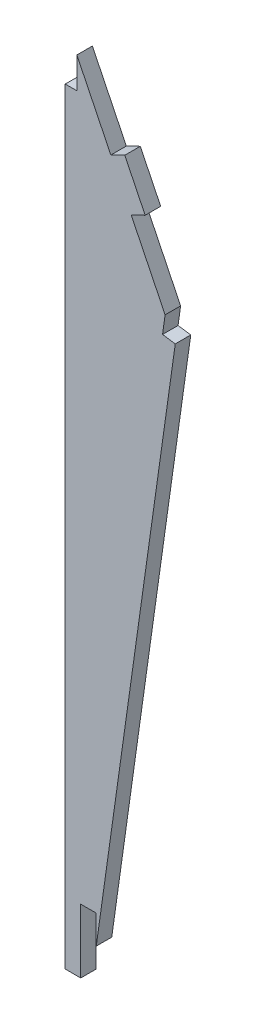
ISO-10303-21;
HEADER;
FILE_DESCRIPTION(('STEP AP214'),'2;1');
FILE_NAME('part.step','',(''),(''),'','','');
FILE_SCHEMA(('AUTOMOTIVE_DESIGN { 1 0 10303 214 1 1 1 1 }'));
ENDSEC;
DATA;
#1=APPLICATION_CONTEXT('core data for automotive mechanical design processes');
#2=APPLICATION_PROTOCOL_DEFINITION('international standard','automotive_design',2000,#1);
#3=PRODUCT_CONTEXT('',#1,'mechanical');
#4=PRODUCT('Part','Part','',(#3));
#5=PRODUCT_RELATED_PRODUCT_CATEGORY('part','',(#4));
#6=PRODUCT_DEFINITION_FORMATION('','',#4);
#7=PRODUCT_DEFINITION_CONTEXT('part definition',#1,'design');
#8=PRODUCT_DEFINITION('design','',#6,#7);
#9=PRODUCT_DEFINITION_SHAPE('','',#8);
#10=(LENGTH_UNIT() NAMED_UNIT(*) SI_UNIT(.MILLI.,.METRE.));
#11=(NAMED_UNIT(*) PLANE_ANGLE_UNIT() SI_UNIT($,.RADIAN.));
#12=(NAMED_UNIT(*) SI_UNIT($,.STERADIAN.) SOLID_ANGLE_UNIT());
#13=UNCERTAINTY_MEASURE_WITH_UNIT(LENGTH_MEASURE(1.E-05),#10,'distance_accuracy_value','');
#14=(GEOMETRIC_REPRESENTATION_CONTEXT(3) GLOBAL_UNCERTAINTY_ASSIGNED_CONTEXT((#13)) GLOBAL_UNIT_ASSIGNED_CONTEXT((#10,
#11,#12)) REPRESENTATION_CONTEXT('',''));
#15=CARTESIAN_POINT('',(0.,0.,0.));
#16=DIRECTION('',(0.,0.,1.));
#17=DIRECTION('',(1.,0.,0.));
#18=AXIS2_PLACEMENT_3D('',#15,#16,#17);
#19=CARTESIAN_POINT('',(11.1121257804898,105.70155755787,2.));
#20=DIRECTION('',(-0.898794046299168,-0.438371146789076,0.));
#21=DIRECTION('',(0.438371146789076,-0.898794046299168,0.));
#22=AXIS2_PLACEMENT_3D('',#19,#20,#21);
#23=PLANE('',#22);
#24=DIRECTION('',(-0.438371146789076,0.898794046299168,0.));
#25=VECTOR('',#24,1.);
#26=CARTESIAN_POINT('',(11.1121257804898,105.70155755787,0.));
#27=LINE('',#26,#25);
#28=CARTESIAN_POINT('',(15.4958372483807,96.7136170948779,0.));
#29=VERTEX_POINT('',#28);
#30=CARTESIAN_POINT('',(11.1121257804898,105.70155755787,0.));
#31=VERTEX_POINT('',#30);
#32=EDGE_CURVE('E174',#29,#31,#27,.T.);
#33=ORIENTED_EDGE('',*,*,#32,.T.);
#34=DIRECTION('',(0.,0.,-1.));
#35=VECTOR('',#34,1.);
#36=CARTESIAN_POINT('',(11.1121257804898,105.70155755787,2.));
#37=LINE('',#36,#35);
#38=CARTESIAN_POINT('',(11.1121257804898,105.70155755787,2.));
#39=VERTEX_POINT('',#38);
#40=EDGE_CURVE('E11',#39,#31,#37,.T.);
#41=ORIENTED_EDGE('',*,*,#40,.F.);
#42=DIRECTION('',(-0.438371146789076,0.898794046299168,0.));
#43=VECTOR('',#42,1.);
#44=CARTESIAN_POINT('',(11.1121257804898,105.70155755787,2.));
#45=LINE('',#44,#43);
#46=CARTESIAN_POINT('',(15.4958372483807,96.7136170948779,2.));
#47=VERTEX_POINT('',#46);
#48=EDGE_CURVE('E202',#47,#39,#45,.T.);
#49=ORIENTED_EDGE('',*,*,#48,.F.);
#50=DIRECTION('',(0.,0.,-1.));
#51=VECTOR('',#50,1.);
#52=CARTESIAN_POINT('',(15.4958372483807,96.7136170948779,2.));
#53=LINE('',#52,#51);
#54=EDGE_CURVE('E170',#47,#29,#53,.T.);
#55=ORIENTED_EDGE('',*,*,#54,.T.);
#56=EDGE_LOOP('',(#33,#41,#49,#55));
#57=FACE_BOUND('',#56,.T.);
#58=ADVANCED_FACE('F36',(#57),#23,.F.);
#59=CARTESIAN_POINT('',(11.1121257804898,105.70155755787,2.));
#60=DIRECTION('',(1.,0.,0.));
#61=DIRECTION('',(0.,0.,-1.));
#62=AXIS2_PLACEMENT_3D('',#59,#60,#61);
#63=PLANE('',#62);
#64=DIRECTION('',(0.,-1.,0.));
#65=VECTOR('',#64,1.);
#66=CARTESIAN_POINT('',(11.1121257804898,105.70155755787,0.));
#67=LINE('',#66,#65);
#68=CARTESIAN_POINT('',(11.1121257804898,101.70155755787,0.));
#69=VERTEX_POINT('',#68);
#70=EDGE_CURVE('E177',#31,#69,#67,.T.);
#71=ORIENTED_EDGE('',*,*,#70,.T.);
#72=DIRECTION('',(0.,0.,-1.));
#73=VECTOR('',#72,1.);
#74=CARTESIAN_POINT('',(11.1121257804898,101.70155755787,2.));
#75=LINE('',#74,#73);
#76=CARTESIAN_POINT('',(11.1121257804898,101.70155755787,2.));
#77=VERTEX_POINT('',#76);
#78=EDGE_CURVE('E44',#77,#69,#75,.T.);
#79=ORIENTED_EDGE('',*,*,#78,.F.);
#80=DIRECTION('',(0.,-1.,0.));
#81=VECTOR('',#80,1.);
#82=CARTESIAN_POINT('',(11.1121257804898,105.70155755787,2.));
#83=LINE('',#82,#81);
#84=EDGE_CURVE('E116',#39,#77,#83,.T.);
#85=ORIENTED_EDGE('',*,*,#84,.F.);
#86=ORIENTED_EDGE('',*,*,#40,.T.);
#87=EDGE_LOOP('',(#71,#79,#85,#86));
#88=FACE_BOUND('',#87,.T.);
#89=ADVANCED_FACE('F295',(#88),#63,.F.);
#90=CARTESIAN_POINT('',(11.1121257804898,101.70155755787,2.));
#91=DIRECTION('',(0.,-1.,0.));
#92=DIRECTION('',(0.,0.,-1.));
#93=AXIS2_PLACEMENT_3D('',#90,#91,#92);
#94=PLANE('',#93);
#95=DIRECTION('',(-1.,0.,0.));
#96=VECTOR('',#95,1.);
#97=CARTESIAN_POINT('',(11.1121257804898,101.70155755787,0.));
#98=LINE('',#97,#96);
#99=CARTESIAN_POINT('',(9.61212578048981,101.70155755787,0.));
#100=VERTEX_POINT('',#99);
#101=EDGE_CURVE('E179',#69,#100,#98,.T.);
#102=ORIENTED_EDGE('',*,*,#101,.T.);
#103=DIRECTION('',(0.,0.,-1.));
#104=VECTOR('',#103,1.);
#105=CARTESIAN_POINT('',(9.61212578048981,101.70155755787,2.));
#106=LINE('',#105,#104);
#107=CARTESIAN_POINT('',(9.61212578048981,101.70155755787,2.));
#108=VERTEX_POINT('',#107);
#109=EDGE_CURVE('E230',#108,#100,#106,.T.);
#110=ORIENTED_EDGE('',*,*,#109,.F.);
#111=DIRECTION('',(-1.,0.,0.));
#112=VECTOR('',#111,1.);
#113=CARTESIAN_POINT('',(11.1121257804898,101.70155755787,2.));
#114=LINE('',#113,#112);
#115=EDGE_CURVE('E238',#77,#108,#114,.T.);
#116=ORIENTED_EDGE('',*,*,#115,.F.);
#117=ORIENTED_EDGE('',*,*,#78,.T.);
#118=EDGE_LOOP('',(#102,#110,#116,#117));
#119=FACE_BOUND('',#118,.T.);
#120=ADVANCED_FACE('F236',(#119),#94,.F.);
#121=CARTESIAN_POINT('',(9.61212578048981,101.70155755787,2.));
#122=DIRECTION('',(1.,0.,0.));
#123=DIRECTION('',(0.,0.,-1.));
#124=AXIS2_PLACEMENT_3D('',#121,#122,#123);
#125=PLANE('',#124);
#126=DIRECTION('',(0.,-1.,0.));
#127=VECTOR('',#126,1.);
#128=CARTESIAN_POINT('',(9.61212578048981,101.70155755787,0.));
#129=LINE('',#128,#127);
#130=CARTESIAN_POINT('',(9.61212578048981,2.83160343748159,0.));
#131=VERTEX_POINT('',#130);
#132=EDGE_CURVE('E181',#100,#131,#129,.T.);
#133=ORIENTED_EDGE('',*,*,#132,.T.);
#134=DIRECTION('',(0.,0.,-1.));
#135=VECTOR('',#134,1.);
#136=CARTESIAN_POINT('',(9.61212578048981,2.83160343748159,2.));
#137=LINE('',#136,#135);
#138=CARTESIAN_POINT('',(9.61212578048981,2.83160343748159,2.));
#139=VERTEX_POINT('',#138);
#140=EDGE_CURVE('E227',#139,#131,#137,.T.);
#141=ORIENTED_EDGE('',*,*,#140,.F.);
#142=DIRECTION('',(0.,-1.,0.));
#143=VECTOR('',#142,1.);
#144=CARTESIAN_POINT('',(9.61212578048981,101.70155755787,2.));
#145=LINE('',#144,#143);
#146=EDGE_CURVE('E256',#108,#139,#145,.T.);
#147=ORIENTED_EDGE('',*,*,#146,.F.);
#148=ORIENTED_EDGE('',*,*,#109,.T.);
#149=EDGE_LOOP('',(#133,#141,#147,#148));
#150=FACE_BOUND('',#149,.T.);
#151=ADVANCED_FACE('F247',(#150),#125,.F.);
#152=CARTESIAN_POINT('',(9.61212578048981,2.83160343748159,2.));
#153=DIRECTION('',(0.,1.,0.));
#154=DIRECTION('',(0.,0.,1.));
#155=AXIS2_PLACEMENT_3D('',#152,#153,#154);
#156=PLANE('',#155);
#157=DIRECTION('',(1.,0.,0.));
#158=VECTOR('',#157,1.);
#159=CARTESIAN_POINT('',(9.61212578048981,2.83160343748159,0.));
#160=LINE('',#159,#158);
#161=CARTESIAN_POINT('',(11.6121257804907,2.83160343748159,0.));
#162=VERTEX_POINT('',#161);
#163=EDGE_CURVE('E183',#131,#162,#160,.T.);
#164=ORIENTED_EDGE('',*,*,#163,.T.);
#165=DIRECTION('',(0.,0.,-1.));
#166=VECTOR('',#165,1.);
#167=CARTESIAN_POINT('',(11.6121257804907,2.83160343748159,2.));
#168=LINE('',#167,#166);
#169=CARTESIAN_POINT('',(11.6121257804907,2.83160343748159,2.));
#170=VERTEX_POINT('',#169);
#171=EDGE_CURVE('E224',#170,#162,#168,.T.);
#172=ORIENTED_EDGE('',*,*,#171,.F.);
#173=DIRECTION('',(1.,0.,0.));
#174=VECTOR('',#173,1.);
#175=CARTESIAN_POINT('',(9.61212578048981,2.83160343748159,2.));
#176=LINE('',#175,#174);
#177=EDGE_CURVE('E253',#139,#170,#176,.T.);
#178=ORIENTED_EDGE('',*,*,#177,.F.);
#179=ORIENTED_EDGE('',*,*,#140,.T.);
#180=EDGE_LOOP('',(#164,#172,#178,#179));
#181=FACE_BOUND('',#180,.T.);
#182=ADVANCED_FACE('F251',(#181),#156,.F.);
#183=CARTESIAN_POINT('',(11.6121257804907,2.83160343748159,2.));
#184=DIRECTION('',(-1.,0.,0.));
#185=DIRECTION('',(0.,0.,1.));
#186=AXIS2_PLACEMENT_3D('',#183,#184,#185);
#187=PLANE('',#186);
#188=DIRECTION('',(0.,1.,0.));
#189=VECTOR('',#188,1.);
#190=CARTESIAN_POINT('',(11.6121257804907,2.83160343748159,0.));
#191=LINE('',#190,#189);
#192=CARTESIAN_POINT('',(11.6121257804907,11.0816034374925,0.));
#193=VERTEX_POINT('',#192);
#194=EDGE_CURVE('E185',#162,#193,#191,.T.);
#195=ORIENTED_EDGE('',*,*,#194,.T.);
#196=DIRECTION('',(0.,0.,-1.));
#197=VECTOR('',#196,1.);
#198=CARTESIAN_POINT('',(11.6121257804907,11.0816034374925,2.));
#199=LINE('',#198,#197);
#200=CARTESIAN_POINT('',(11.6121257804907,11.0816034374925,2.));
#201=VERTEX_POINT('',#200);
#202=EDGE_CURVE('E221',#201,#193,#199,.T.);
#203=ORIENTED_EDGE('',*,*,#202,.F.);
#204=DIRECTION('',(0.,1.,0.));
#205=VECTOR('',#204,1.);
#206=CARTESIAN_POINT('',(11.6121257804907,2.83160343748159,2.));
#207=LINE('',#206,#205);
#208=EDGE_CURVE('E255',#170,#201,#207,.T.);
#209=ORIENTED_EDGE('',*,*,#208,.F.);
#210=ORIENTED_EDGE('',*,*,#171,.T.);
#211=EDGE_LOOP('',(#195,#203,#209,#210));
#212=FACE_BOUND('',#211,.T.);
#213=ADVANCED_FACE('F308',(#212),#187,.F.);
#214=CARTESIAN_POINT('',(11.6121257804907,11.0816034374925,2.));
#215=DIRECTION('',(0.,1.,0.));
#216=DIRECTION('',(0.,0.,1.));
#217=AXIS2_PLACEMENT_3D('',#214,#215,#216);
#218=PLANE('',#217);
#219=DIRECTION('',(1.,0.,0.));
#220=VECTOR('',#219,1.);
#221=CARTESIAN_POINT('',(11.6121257804907,11.0816034374925,0.));
#222=LINE('',#221,#220);
#223=CARTESIAN_POINT('',(13.6121257804907,11.0816034374925,0.));
#224=VERTEX_POINT('',#223);
#225=EDGE_CURVE('E187',#193,#224,#222,.T.);
#226=ORIENTED_EDGE('',*,*,#225,.T.);
#227=DIRECTION('',(0.,0.,-1.));
#228=VECTOR('',#227,1.);
#229=CARTESIAN_POINT('',(13.6121257804907,11.0816034374925,2.));
#230=LINE('',#229,#228);
#231=CARTESIAN_POINT('',(13.6121257804907,11.0816034374925,2.));
#232=VERTEX_POINT('',#231);
#233=EDGE_CURVE('E218',#232,#224,#230,.T.);
#234=ORIENTED_EDGE('',*,*,#233,.F.);
#235=DIRECTION('',(1.,0.,0.));
#236=VECTOR('',#235,1.);
#237=CARTESIAN_POINT('',(11.6121257804907,11.0816034374925,2.));
#238=LINE('',#237,#236);
#239=EDGE_CURVE('E258',#201,#232,#238,.T.);
#240=ORIENTED_EDGE('',*,*,#239,.F.);
#241=ORIENTED_EDGE('',*,*,#202,.T.);
#242=EDGE_LOOP('',(#226,#234,#240,#241));
#243=FACE_BOUND('',#242,.T.);
#244=ADVANCED_FACE('F311',(#243),#218,.F.);
#245=CARTESIAN_POINT('',(13.6121257804907,11.0816034374925,2.));
#246=DIRECTION('',(1.,0.,0.));
#247=DIRECTION('',(0.,0.,-1.));
#248=AXIS2_PLACEMENT_3D('',#245,#246,#247);
#249=PLANE('',#248);
#250=DIRECTION('',(0.,-1.,0.));
#251=VECTOR('',#250,1.);
#252=CARTESIAN_POINT('',(13.6121257804907,11.0816034374925,0.));
#253=LINE('',#252,#251);
#254=CARTESIAN_POINT('',(13.6121257804907,7.39072847064062,0.));
#255=VERTEX_POINT('',#254);
#256=EDGE_CURVE('E189',#224,#255,#253,.T.);
#257=ORIENTED_EDGE('',*,*,#256,.T.);
#258=DIRECTION('',(0.,0.,-1.));
#259=VECTOR('',#258,1.);
#260=CARTESIAN_POINT('',(13.6121257804907,7.39072847064062,2.));
#261=LINE('',#260,#259);
#262=CARTESIAN_POINT('',(13.6121257804907,7.39072847064062,2.));
#263=VERTEX_POINT('',#262);
#264=EDGE_CURVE('E215',#263,#255,#261,.T.);
#265=ORIENTED_EDGE('',*,*,#264,.F.);
#266=DIRECTION('',(0.,-1.,0.));
#267=VECTOR('',#266,1.);
#268=CARTESIAN_POINT('',(13.6121257804907,11.0816034374925,2.));
#269=LINE('',#268,#267);
#270=EDGE_CURVE('E264',#232,#263,#269,.T.);
#271=ORIENTED_EDGE('',*,*,#270,.F.);
#272=ORIENTED_EDGE('',*,*,#233,.T.);
#273=EDGE_LOOP('',(#257,#265,#271,#272));
#274=FACE_BOUND('',#273,.T.);
#275=ADVANCED_FACE('F315',(#274),#249,.F.);
#276=CARTESIAN_POINT('',(13.6121257804907,7.39072847064062,2.));
#277=DIRECTION('',(-0.990227596822008,0.139460770441409,0.));
#278=DIRECTION('',(-0.139460770441409,-0.990227596822008,0.));
#279=AXIS2_PLACEMENT_3D('',#276,#277,#278);
#280=PLANE('',#279);
#281=DIRECTION('',(0.139460770441409,0.990227596822008,0.));
#282=VECTOR('',#281,1.);
#283=CARTESIAN_POINT('',(13.6121257804907,7.39072847064062,0.));
#284=LINE('',#283,#282);
#285=CARTESIAN_POINT('',(23.8059659715545,79.7710963894137,0.));
#286=VERTEX_POINT('',#285);
#287=EDGE_CURVE('E191',#255,#286,#284,.T.);
#288=ORIENTED_EDGE('',*,*,#287,.T.);
#289=DIRECTION('',(0.,0.,-1.));
#290=VECTOR('',#289,1.);
#291=CARTESIAN_POINT('',(23.8059659715545,79.7710963894137,2.));
#292=LINE('',#291,#290);
#293=CARTESIAN_POINT('',(23.8059659715545,79.7710963894137,2.));
#294=VERTEX_POINT('',#293);
#295=EDGE_CURVE('E212',#294,#286,#292,.T.);
#296=ORIENTED_EDGE('',*,*,#295,.F.);
#297=DIRECTION('',(0.139460770441409,0.990227596822008,0.));
#298=VECTOR('',#297,1.);
#299=CARTESIAN_POINT('',(13.6121257804907,7.39072847064062,2.));
#300=LINE('',#299,#298);
#301=EDGE_CURVE('E266',#263,#294,#300,.T.);
#302=ORIENTED_EDGE('',*,*,#301,.F.);
#303=ORIENTED_EDGE('',*,*,#264,.T.);
#304=EDGE_LOOP('',(#288,#296,#302,#303));
#305=FACE_BOUND('',#304,.T.);
#306=ADVANCED_FACE('F319',(#305),#280,.F.);
#307=CARTESIAN_POINT('',(23.8059659715545,79.7710963894137,2.));
#308=DIRECTION('',(-0.139460770441563,-0.990227596821986,0.));
#309=DIRECTION('',(0.990227596821986,-0.139460770441563,0.));
#310=AXIS2_PLACEMENT_3D('',#307,#308,#309);
#311=PLANE('',#310);
#312=DIRECTION('',(-0.990227596821986,0.139460770441563,0.));
#313=VECTOR('',#312,1.);
#314=CARTESIAN_POINT('',(23.8059659715545,79.7710963894137,0.));
#315=LINE('',#314,#313);
#316=CARTESIAN_POINT('',(22.1644159934294,80.0022875068926,0.));
#317=VERTEX_POINT('',#316);
#318=EDGE_CURVE('E193',#286,#317,#315,.T.);
#319=ORIENTED_EDGE('',*,*,#318,.T.);
#320=DIRECTION('',(0.,0.,-1.));
#321=VECTOR('',#320,1.);
#322=CARTESIAN_POINT('',(22.1644159934294,80.0022875068926,2.));
#323=LINE('',#322,#321);
#324=CARTESIAN_POINT('',(22.1644159934294,80.0022875068926,2.));
#325=VERTEX_POINT('',#324);
#326=EDGE_CURVE('E209',#325,#317,#323,.T.);
#327=ORIENTED_EDGE('',*,*,#326,.F.);
#328=DIRECTION('',(-0.990227596821986,0.139460770441563,0.));
#329=VECTOR('',#328,1.);
#330=CARTESIAN_POINT('',(23.8059659715545,79.7710963894137,2.));
#331=LINE('',#330,#329);
#332=EDGE_CURVE('E268',#294,#325,#331,.T.);
#333=ORIENTED_EDGE('',*,*,#332,.F.);
#334=ORIENTED_EDGE('',*,*,#295,.T.);
#335=EDGE_LOOP('',(#319,#327,#333,#334));
#336=FACE_BOUND('',#335,.T.);
#337=ADVANCED_FACE('F323',(#336),#311,.F.);
#338=CARTESIAN_POINT('',(22.1644159934294,80.0022875068926,2.));
#339=DIRECTION('',(-0.990227596822041,0.139460770441173,0.));
#340=DIRECTION('',(-0.139460770441173,-0.990227596822041,0.));
#341=AXIS2_PLACEMENT_3D('',#338,#339,#340);
#342=PLANE('',#341);
#343=DIRECTION('',(0.139460770441173,0.990227596822041,0.));
#344=VECTOR('',#343,1.);
#345=CARTESIAN_POINT('',(22.1644159934294,80.0022875068926,0.));
#346=LINE('',#345,#344);
#347=CARTESIAN_POINT('',(22.4964905755041,82.3601506847117,0.));
#348=VERTEX_POINT('',#347);
#349=EDGE_CURVE('E195',#317,#348,#346,.T.);
#350=ORIENTED_EDGE('',*,*,#349,.T.);
#351=DIRECTION('',(0.,0.,-1.));
#352=VECTOR('',#351,1.);
#353=CARTESIAN_POINT('',(22.4964905755041,82.3601506847117,2.));
#354=LINE('',#353,#352);
#355=CARTESIAN_POINT('',(22.4964905755041,82.3601506847117,2.));
#356=VERTEX_POINT('',#355);
#357=EDGE_CURVE('E206',#356,#348,#354,.T.);
#358=ORIENTED_EDGE('',*,*,#357,.F.);
#359=DIRECTION('',(0.139460770441173,0.990227596822041,0.));
#360=VECTOR('',#359,1.);
#361=CARTESIAN_POINT('',(22.1644159934294,80.0022875068926,2.));
#362=LINE('',#361,#360);
#363=EDGE_CURVE('E270',#325,#356,#362,.T.);
#364=ORIENTED_EDGE('',*,*,#363,.F.);
#365=ORIENTED_EDGE('',*,*,#326,.T.);
#366=EDGE_LOOP('',(#350,#358,#364,#365));
#367=FACE_BOUND('',#366,.T.);
#368=ADVANCED_FACE('F276',(#367),#342,.F.);
#369=CARTESIAN_POINT('',(18.1260641291155,91.3208528170826,2.));
#370=DIRECTION('',(-0.898794046299179,-0.438371146789053,0.));
#371=DIRECTION('',(0.438371146789053,-0.898794046299179,0.));
#372=AXIS2_PLACEMENT_3D('',#369,#370,#371);
#373=PLANE('',#372);
#374=DIRECTION('',(-0.438371146789053,0.898794046299179,0.));
#375=VECTOR('',#374,1.);
#376=CARTESIAN_POINT('',(18.1260641291155,91.3208528170826,0.));
#377=LINE('',#376,#375);
#378=CARTESIAN_POINT('',(18.1260641291155,91.3208528170826,0.));
#379=VERTEX_POINT('',#378);
#380=EDGE_CURVE('E197',#348,#379,#377,.T.);
#381=ORIENTED_EDGE('',*,*,#380,.T.);
#382=DIRECTION('',(0.,0.,-1.));
#383=VECTOR('',#382,1.);
#384=CARTESIAN_POINT('',(18.1260641291155,91.3208528170826,2.));
#385=LINE('',#384,#383);
#386=CARTESIAN_POINT('',(18.1260641291155,91.3208528170826,2.));
#387=VERTEX_POINT('',#386);
#388=EDGE_CURVE('E165',#387,#379,#385,.T.);
#389=ORIENTED_EDGE('',*,*,#388,.F.);
#390=DIRECTION('',(-0.438371146789053,0.898794046299179,0.));
#391=VECTOR('',#390,1.);
#392=CARTESIAN_POINT('',(18.1260641291155,91.3208528170826,2.));
#393=LINE('',#392,#391);
#394=EDGE_CURVE('E156',#356,#387,#393,.T.);
#395=ORIENTED_EDGE('',*,*,#394,.F.);
#396=ORIENTED_EDGE('',*,*,#357,.T.);
#397=EDGE_LOOP('',(#381,#389,#395,#396));
#398=FACE_BOUND('',#397,.T.);
#399=ADVANCED_FACE('F280',(#398),#373,.F.);
#400=CARTESIAN_POINT('',(19.9236522217143,92.1975951106606,2.));
#401=DIRECTION('',(-0.438371146788926,0.898794046299241,0.));
#402=DIRECTION('',(-0.898794046299241,-0.438371146788927,0.));
#403=AXIS2_PLACEMENT_3D('',#400,#401,#402);
#404=PLANE('',#403);
#405=DIRECTION('',(0.898794046299241,0.438371146788926,0.));
#406=VECTOR('',#405,1.);
#407=CARTESIAN_POINT('',(19.9236522217143,92.1975951106606,0.));
#408=LINE('',#407,#406);
#409=CARTESIAN_POINT('',(19.9236522217143,92.1975951106606,0.));
#410=VERTEX_POINT('',#409);
#411=EDGE_CURVE('E164',#379,#410,#408,.T.);
#412=ORIENTED_EDGE('',*,*,#411,.T.);
#413=DIRECTION('',(0.,0.,-1.));
#414=VECTOR('',#413,1.);
#415=CARTESIAN_POINT('',(19.9236522217143,92.1975951106606,2.));
#416=LINE('',#415,#414);
#417=CARTESIAN_POINT('',(19.9236522217143,92.1975951106606,2.));
#418=VERTEX_POINT('',#417);
#419=EDGE_CURVE('E161',#418,#410,#416,.T.);
#420=ORIENTED_EDGE('',*,*,#419,.F.);
#421=DIRECTION('',(0.898794046299241,0.438371146788926,0.));
#422=VECTOR('',#421,1.);
#423=CARTESIAN_POINT('',(19.9236522217143,92.1975951106606,2.));
#424=LINE('',#423,#422);
#425=EDGE_CURVE('E150',#387,#418,#424,.T.);
#426=ORIENTED_EDGE('',*,*,#425,.F.);
#427=ORIENTED_EDGE('',*,*,#388,.T.);
#428=EDGE_LOOP('',(#412,#420,#426,#427));
#429=FACE_BOUND('',#428,.T.);
#430=ADVANCED_FACE('F162',(#429),#404,.F.);
#431=CARTESIAN_POINT('',(17.2934253409767,97.590359388455,2.));
#432=DIRECTION('',(-0.898794046298942,-0.438371146789539,0.));
#433=DIRECTION('',(0.438371146789539,-0.898794046298942,0.));
#434=AXIS2_PLACEMENT_3D('',#431,#432,#433);
#435=PLANE('',#434);
#436=DIRECTION('',(-0.438371146789539,0.898794046298942,0.));
#437=VECTOR('',#436,1.);
#438=CARTESIAN_POINT('',(17.2934253409767,97.590359388455,0.));
#439=LINE('',#438,#437);
#440=CARTESIAN_POINT('',(17.2934253409767,97.590359388455,0.));
#441=VERTEX_POINT('',#440);
#442=EDGE_CURVE('E102',#410,#441,#439,.T.);
#443=ORIENTED_EDGE('',*,*,#442,.T.);
#444=DIRECTION('',(0.,0.,-1.));
#445=VECTOR('',#444,1.);
#446=CARTESIAN_POINT('',(17.2934253409767,97.590359388455,2.));
#447=LINE('',#446,#445);
#448=CARTESIAN_POINT('',(17.2934253409767,97.590359388455,2.));
#449=VERTEX_POINT('',#448);
#450=EDGE_CURVE('E166',#449,#441,#447,.T.);
#451=ORIENTED_EDGE('',*,*,#450,.F.);
#452=DIRECTION('',(-0.438371146789539,0.898794046298942,0.));
#453=VECTOR('',#452,1.);
#454=CARTESIAN_POINT('',(17.2934253409767,97.590359388455,2.));
#455=LINE('',#454,#453);
#456=EDGE_CURVE('E154',#418,#449,#455,.T.);
#457=ORIENTED_EDGE('',*,*,#456,.F.);
#458=ORIENTED_EDGE('',*,*,#419,.T.);
#459=EDGE_LOOP('',(#443,#451,#457,#458));
#460=FACE_BOUND('',#459,.T.);
#461=ADVANCED_FACE('F168',(#460),#435,.F.);
#462=CARTESIAN_POINT('',(15.4958372483807,96.7136170948779,2.));
#463=DIRECTION('',(0.4383711467891,-0.898794046299156,0.));
#464=DIRECTION('',(0.898794046299156,0.4383711467891,0.));
#465=AXIS2_PLACEMENT_3D('',#462,#463,#464);
#466=PLANE('',#465);
#467=DIRECTION('',(-0.898794046299156,-0.4383711467891,0.));
#468=VECTOR('',#467,1.);
#469=CARTESIAN_POINT('',(15.4958372483807,96.7136170948779,0.));
#470=LINE('',#469,#468);
#471=EDGE_CURVE('E108',#441,#29,#470,.T.);
#472=ORIENTED_EDGE('',*,*,#471,.T.);
#473=ORIENTED_EDGE('',*,*,#54,.F.);
#474=DIRECTION('',(-0.898794046299156,-0.4383711467891,0.));
#475=VECTOR('',#474,1.);
#476=CARTESIAN_POINT('',(15.4958372483807,96.7136170948779,2.));
#477=LINE('',#476,#475);
#478=EDGE_CURVE('E52',#449,#47,#477,.T.);
#479=ORIENTED_EDGE('',*,*,#478,.F.);
#480=ORIENTED_EDGE('',*,*,#450,.T.);
#481=EDGE_LOOP('',(#472,#473,#479,#480));
#482=FACE_BOUND('',#481,.T.);
#483=ADVANCED_FACE('F284',(#482),#466,.F.);
#484=CARTESIAN_POINT('',(0.,0.,2.));
#485=DIRECTION('',(0.,0.,1.));
#486=DIRECTION('',(1.,0.,0.));
#487=AXIS2_PLACEMENT_3D('',#484,#485,#486);
#488=PLANE('',#487);
#489=ORIENTED_EDGE('',*,*,#48,.T.);
#490=ORIENTED_EDGE('',*,*,#84,.T.);
#491=ORIENTED_EDGE('',*,*,#115,.T.);
#492=ORIENTED_EDGE('',*,*,#146,.T.);
#493=ORIENTED_EDGE('',*,*,#177,.T.);
#494=ORIENTED_EDGE('',*,*,#208,.T.);
#495=ORIENTED_EDGE('',*,*,#239,.T.);
#496=ORIENTED_EDGE('',*,*,#270,.T.);
#497=ORIENTED_EDGE('',*,*,#301,.T.);
#498=ORIENTED_EDGE('',*,*,#332,.T.);
#499=ORIENTED_EDGE('',*,*,#363,.T.);
#500=ORIENTED_EDGE('',*,*,#394,.T.);
#501=ORIENTED_EDGE('',*,*,#425,.T.);
#502=ORIENTED_EDGE('',*,*,#456,.T.);
#503=ORIENTED_EDGE('',*,*,#478,.T.);
#504=EDGE_LOOP('',(#489,#490,#491,#492,#493,#494,#495,#496,#497,#498,#499,#500,#501,#502,#503));
#505=FACE_BOUND('',#504,.T.);
#506=ADVANCED_FACE('F152',(#505),#488,.T.);
#507=CARTESIAN_POINT('',(0.,0.,0.));
#508=DIRECTION('',(0.,0.,1.));
#509=DIRECTION('',(1.,0.,0.));
#510=AXIS2_PLACEMENT_3D('',#507,#508,#509);
#511=PLANE('',#510);
#512=ORIENTED_EDGE('',*,*,#32,.F.);
#513=ORIENTED_EDGE('',*,*,#471,.F.);
#514=ORIENTED_EDGE('',*,*,#442,.F.);
#515=ORIENTED_EDGE('',*,*,#411,.F.);
#516=ORIENTED_EDGE('',*,*,#380,.F.);
#517=ORIENTED_EDGE('',*,*,#349,.F.);
#518=ORIENTED_EDGE('',*,*,#318,.F.);
#519=ORIENTED_EDGE('',*,*,#287,.F.);
#520=ORIENTED_EDGE('',*,*,#256,.F.);
#521=ORIENTED_EDGE('',*,*,#225,.F.);
#522=ORIENTED_EDGE('',*,*,#194,.F.);
#523=ORIENTED_EDGE('',*,*,#163,.F.);
#524=ORIENTED_EDGE('',*,*,#132,.F.);
#525=ORIENTED_EDGE('',*,*,#101,.F.);
#526=ORIENTED_EDGE('',*,*,#70,.F.);
#527=EDGE_LOOP('',(#512,#513,#514,#515,#516,#517,#518,#519,#520,#521,#522,#523,#524,#525,#526));
#528=FACE_BOUND('',#527,.T.);
#529=ADVANCED_FACE('F242',(#528),#511,.F.);
#530=CLOSED_SHELL('',(#58,#89,#120,#151,#182,#213,#244,#275,#306,#337,#368,#399,#430,#461,#483,
#506,#529));
#531=MANIFOLD_SOLID_BREP('B2',#530);
#532=ADVANCED_BREP_SHAPE_REPRESENTATION('',(#18,#531),#14);
#533=SHAPE_DEFINITION_REPRESENTATION(#9,#532);
ENDSEC;
END-ISO-10303-21;
